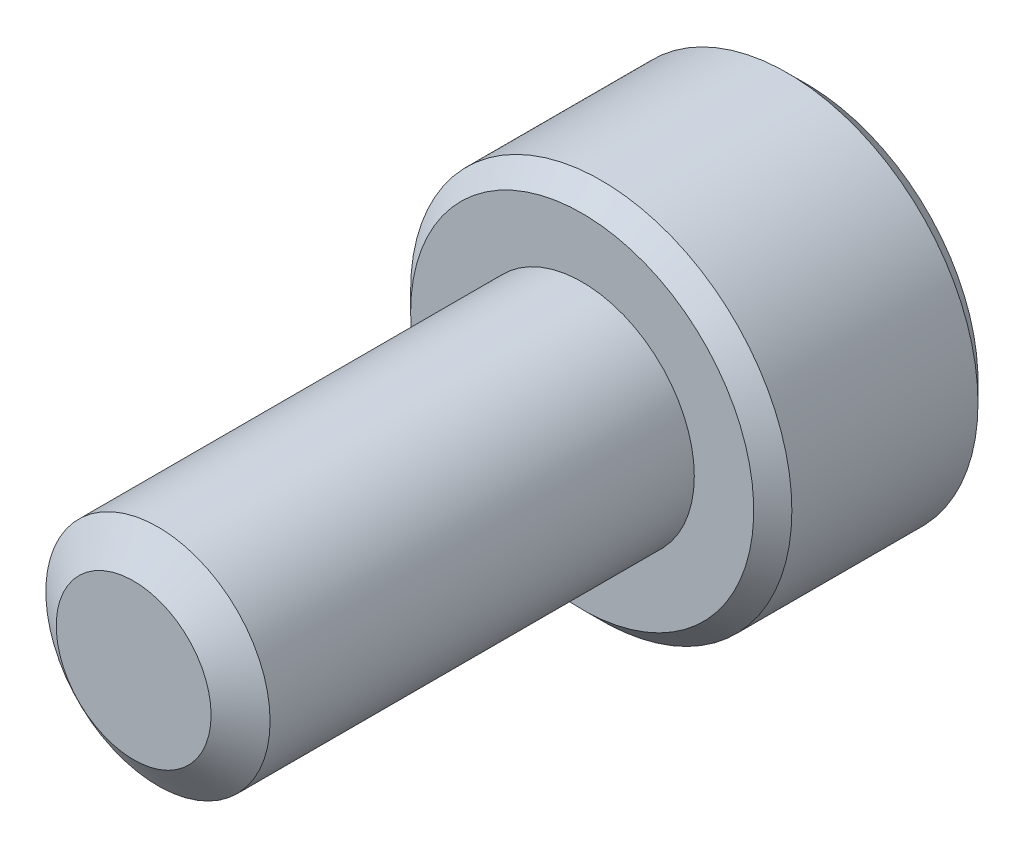
ISO-10303-21;
HEADER;
FILE_DESCRIPTION(('STEP AP214'),'2;1');
FILE_NAME('part.step','',(''),(''),'','','');
FILE_SCHEMA(('AUTOMOTIVE_DESIGN { 1 0 10303 214 1 1 1 1 }'));
ENDSEC;
DATA;
#1=APPLICATION_CONTEXT('core data for automotive mechanical design processes');
#2=APPLICATION_PROTOCOL_DEFINITION('international standard','automotive_design',2000,#1);
#3=PRODUCT_CONTEXT('',#1,'mechanical');
#4=PRODUCT('Part','Part','',(#3));
#5=PRODUCT_RELATED_PRODUCT_CATEGORY('part','',(#4));
#6=PRODUCT_DEFINITION_FORMATION('','',#4);
#7=PRODUCT_DEFINITION_CONTEXT('part definition',#1,'design');
#8=PRODUCT_DEFINITION('design','',#6,#7);
#9=PRODUCT_DEFINITION_SHAPE('','',#8);
#10=(LENGTH_UNIT() NAMED_UNIT(*) SI_UNIT(.MILLI.,.METRE.));
#11=(NAMED_UNIT(*) PLANE_ANGLE_UNIT() SI_UNIT($,.RADIAN.));
#12=(NAMED_UNIT(*) SI_UNIT($,.STERADIAN.) SOLID_ANGLE_UNIT());
#13=UNCERTAINTY_MEASURE_WITH_UNIT(LENGTH_MEASURE(1.E-05),#10,'distance_accuracy_value','');
#14=(GEOMETRIC_REPRESENTATION_CONTEXT(3) GLOBAL_UNCERTAINTY_ASSIGNED_CONTEXT((#13)) GLOBAL_UNIT_ASSIGNED_CONTEXT((#10,
#11,#12)) REPRESENTATION_CONTEXT('',''));
#15=CARTESIAN_POINT('',(0.,0.,0.));
#16=DIRECTION('',(0.,0.,1.));
#17=DIRECTION('',(1.,0.,0.));
#18=AXIS2_PLACEMENT_3D('',#15,#16,#17);
#19=CARTESIAN_POINT('',(0.,0.,-10.));
#20=DIRECTION('',(0.,0.,1.));
#21=DIRECTION('',(1.,0.,0.));
#22=AXIS2_PLACEMENT_3D('',#19,#20,#21);
#23=CYLINDRICAL_SURFACE('',#22,2.5);
#24=CARTESIAN_POINT('',(0.,0.,-10.));
#25=DIRECTION('',(0.,0.,-1.));
#26=DIRECTION('',(-1.,0.,0.));
#27=AXIS2_PLACEMENT_3D('',#24,#25,#26);
#28=CIRCLE('',#27,2.5);
#29=CARTESIAN_POINT('',(-2.50000000000001,0.,-10.));
#30=VERTEX_POINT('',#29);
#31=EDGE_CURVE('E216',#30,#30,#28,.F.);
#32=ORIENTED_EDGE('',*,*,#31,.T.);
#33=EDGE_LOOP('',(#32));
#34=FACE_BOUND('',#33,.T.);
#35=CARTESIAN_POINT('',(0.,0.,-0.541691224311858));
#36=DIRECTION('',(0.,0.,1.));
#37=DIRECTION('',(1.,0.,0.));
#38=AXIS2_PLACEMENT_3D('',#35,#36,#37);
#39=CIRCLE('',#38,2.5);
#40=CARTESIAN_POINT('',(2.50000000000001,0.,-0.541691224311858));
#41=VERTEX_POINT('',#40);
#42=EDGE_CURVE('E110',#41,#41,#39,.T.);
#43=ORIENTED_EDGE('',*,*,#42,.F.);
#44=EDGE_LOOP('',(#43));
#45=FACE_BOUND('',#44,.T.);
#46=ADVANCED_FACE('F36',(#34,#45),#23,.T.);
#47=CARTESIAN_POINT('',(0.,0.,0.));
#48=DIRECTION('',(0.,0.,-1.));
#49=DIRECTION('',(-1.,0.,0.));
#50=AXIS2_PLACEMENT_3D('',#47,#48,#49);
#51=CONICAL_SURFACE('',#50,1.72638475772933,0.959931088596884);
#52=ORIENTED_EDGE('',*,*,#42,.T.);
#53=EDGE_LOOP('',(#52));
#54=FACE_BOUND('',#53,.T.);
#55=CARTESIAN_POINT('',(0.,0.,0.));
#56=DIRECTION('',(0.,0.,1.));
#57=DIRECTION('',(1.,0.,0.));
#58=AXIS2_PLACEMENT_3D('',#55,#56,#57);
#59=CIRCLE('',#58,1.72638475772933);
#60=CARTESIAN_POINT('',(1.72638475772934,0.,0.));
#61=VERTEX_POINT('',#60);
#62=EDGE_CURVE('E214',#61,#61,#59,.T.);
#63=ORIENTED_EDGE('',*,*,#62,.F.);
#64=EDGE_LOOP('',(#63));
#65=FACE_BOUND('',#64,.T.);
#66=ADVANCED_FACE('F197',(#54,#65),#51,.T.);
#67=CARTESIAN_POINT('',(0.,0.,0.));
#68=DIRECTION('',(0.,0.,1.));
#69=DIRECTION('',(1.,0.,0.));
#70=AXIS2_PLACEMENT_3D('',#67,#68,#69);
#71=PLANE('',#70);
#72=ORIENTED_EDGE('',*,*,#62,.T.);
#73=EDGE_LOOP('',(#72));
#74=FACE_BOUND('',#73,.T.);
#75=ADVANCED_FACE('F194',(#74),#71,.T.);
#76=CARTESIAN_POINT('',(0.,0.,-15.));
#77=DIRECTION('',(0.,0.,1.));
#78=DIRECTION('',(1.,0.,0.));
#79=AXIS2_PLACEMENT_3D('',#76,#77,#78);
#80=CYLINDRICAL_SURFACE('',#79,4.25);
#81=CARTESIAN_POINT('',(0.,0.,-14.575));
#82=DIRECTION('',(0.,0.,-1.));
#83=DIRECTION('',(-1.,0.,0.));
#84=AXIS2_PLACEMENT_3D('',#81,#82,#83);
#85=CIRCLE('',#84,4.25);
#86=CARTESIAN_POINT('',(-4.25000000000001,0.,-14.575));
#87=VERTEX_POINT('',#86);
#88=EDGE_CURVE('E44',#87,#87,#85,.F.);
#89=ORIENTED_EDGE('',*,*,#88,.T.);
#90=EDGE_LOOP('',(#89));
#91=FACE_BOUND('',#90,.T.);
#92=CARTESIAN_POINT('',(0.,0.,-10.425));
#93=DIRECTION('',(0.,0.,-1.));
#94=DIRECTION('',(-1.,0.,0.));
#95=AXIS2_PLACEMENT_3D('',#92,#93,#94);
#96=CIRCLE('',#95,4.25);
#97=CARTESIAN_POINT('',(-4.25000000000001,0.,-10.425));
#98=VERTEX_POINT('',#97);
#99=EDGE_CURVE('E173',#98,#98,#96,.T.);
#100=ORIENTED_EDGE('',*,*,#99,.T.);
#101=EDGE_LOOP('',(#100));
#102=FACE_BOUND('',#101,.T.);
#103=ADVANCED_FACE('F178',(#91,#102),#80,.T.);
#104=CARTESIAN_POINT('',(0.,0.,-15.));
#105=DIRECTION('',(0.,0.,-1.));
#106=DIRECTION('',(-1.,0.,0.));
#107=AXIS2_PLACEMENT_3D('',#104,#105,#106);
#108=PLANE('',#107);
#109=CARTESIAN_POINT('',(0.,0.,-15.));
#110=DIRECTION('',(0.,0.,-1.));
#111=DIRECTION('',(-1.,0.,0.));
#112=AXIS2_PLACEMENT_3D('',#109,#110,#111);
#113=CIRCLE('',#112,3.825);
#114=CARTESIAN_POINT('',(-3.82500000000001,0.,-15.));
#115=VERTEX_POINT('',#114);
#116=EDGE_CURVE('E109',#115,#115,#113,.T.);
#117=ORIENTED_EDGE('',*,*,#116,.T.);
#118=EDGE_LOOP('',(#117));
#119=FACE_BOUND('',#118,.T.);
#120=CARTESIAN_POINT('',(0.,0.,-15.));
#121=DIRECTION('',(0.,0.,-1.));
#122=DIRECTION('',(-1.,0.,0.));
#123=AXIS2_PLACEMENT_3D('',#120,#121,#122);
#124=CIRCLE('',#123,2.3094010767585);
#125=CARTESIAN_POINT('',(-2.,1.15470053837925,-15.));
#126=VERTEX_POINT('',#125);
#127=CARTESIAN_POINT('',(0.,2.3094010767585,-15.));
#128=VERTEX_POINT('',#127);
#129=EDGE_CURVE('E90',#126,#128,#124,.T.);
#130=ORIENTED_EDGE('',*,*,#129,.F.);
#131=CARTESIAN_POINT('',(-2.00000000000002,-1.15470053837927,-15.));
#132=VERTEX_POINT('',#131);
#133=EDGE_CURVE('E50',#132,#126,#124,.T.);
#134=ORIENTED_EDGE('',*,*,#133,.F.);
#135=CARTESIAN_POINT('',(0.,-2.3094010767585,-15.));
#136=VERTEX_POINT('',#135);
#137=EDGE_CURVE('E275',#136,#132,#124,.T.);
#138=ORIENTED_EDGE('',*,*,#137,.F.);
#139=CARTESIAN_POINT('',(1.99999999999999,-1.15470053837924,-15.));
#140=VERTEX_POINT('',#139);
#141=EDGE_CURVE('E57',#140,#136,#124,.T.);
#142=ORIENTED_EDGE('',*,*,#141,.F.);
#143=CARTESIAN_POINT('',(2.00000000000001,1.15470053837929,-15.));
#144=VERTEX_POINT('',#143);
#145=EDGE_CURVE('E131',#144,#140,#124,.T.);
#146=ORIENTED_EDGE('',*,*,#145,.F.);
#147=EDGE_CURVE('E99',#128,#144,#124,.T.);
#148=ORIENTED_EDGE('',*,*,#147,.F.);
#149=EDGE_LOOP('',(#130,#134,#138,#142,#146,#148));
#150=FACE_BOUND('',#149,.T.);
#151=ADVANCED_FACE('F130',(#119,#150),#108,.T.);
#152=CARTESIAN_POINT('',(0.,0.,-10.));
#153=DIRECTION('',(0.,0.,-1.));
#154=DIRECTION('',(-1.,0.,0.));
#155=AXIS2_PLACEMENT_3D('',#152,#153,#154);
#156=PLANE('',#155);
#157=CARTESIAN_POINT('',(0.,0.,-10.));
#158=DIRECTION('',(0.,0.,-1.));
#159=DIRECTION('',(-1.,0.,0.));
#160=AXIS2_PLACEMENT_3D('',#157,#158,#159);
#161=CIRCLE('',#160,3.825);
#162=CARTESIAN_POINT('',(-3.82500000000001,0.,-10.));
#163=VERTEX_POINT('',#162);
#164=EDGE_CURVE('E11',#163,#163,#161,.F.);
#165=ORIENTED_EDGE('',*,*,#164,.T.);
#166=EDGE_LOOP('',(#165));
#167=FACE_BOUND('',#166,.T.);
#168=ORIENTED_EDGE('',*,*,#31,.F.);
#169=EDGE_LOOP('',(#168));
#170=FACE_BOUND('',#169,.T.);
#171=ADVANCED_FACE('F187',(#167,#170),#156,.F.);
#172=CARTESIAN_POINT('',(0.,0.,-15.));
#173=DIRECTION('',(0.,0.,-1.));
#174=DIRECTION('',(-1.,0.,0.));
#175=AXIS2_PLACEMENT_3D('',#172,#173,#174);
#176=CONICAL_SURFACE('',#175,2.3094010767585,0.78539816339745);
#177=ORIENTED_EDGE('',*,*,#147,.T.);
#178=CARTESIAN_POINT('',(-0.000199999999989271,2.30951654681237,-15.0001154787137));
#179=CARTESIAN_POINT('',(0.0685530340307101,2.26982196410712,-14.9604530902256));
#180=CARTESIAN_POINT('',(0.138455742135513,2.22946361676572,-14.9231199822842));
#181=CARTESIAN_POINT('',(0.280995244550437,2.14716839667631,-14.8547636851362));
#182=CARTESIAN_POINT('',(0.353645597565361,2.10522369580642,-14.8237785337372));
#183=CARTESIAN_POINT('',(0.500141601053975,2.02064418875706,-14.7707002165442));
#184=CARTESIAN_POINT('',(0.573949935246298,1.97803092714269,-14.7484736271766));
#185=CARTESIAN_POINT('',(0.723191631835269,1.89186619344273,-14.7142288166751));
#186=CARTESIAN_POINT('',(0.798620433918157,1.84831735425553,-14.7021850291441));
#187=CARTESIAN_POINT('',(0.928615500671082,1.77326466747241,-14.6913185119056));
#188=CARTESIAN_POINT('',(0.983013783970109,1.74185780396625,-14.68970975361));
#189=CARTESIAN_POINT('',(1.09172145551969,1.67909540053412,-14.6924188775987));
#190=CARTESIAN_POINT('',(1.14603080592134,1.64773988246022,-14.696738837758));
#191=CARTESIAN_POINT('',(1.25413672758934,1.58532489948421,-14.7110595674099));
#192=CARTESIAN_POINT('',(1.30793265655479,1.55426580541469,-14.721066692762));
#193=CARTESIAN_POINT('',(1.41459426230558,1.49268469862228,-14.7462124302497));
#194=CARTESIAN_POINT('',(1.46746001007072,1.46216264491918,-14.7613506490422));
#195=CARTESIAN_POINT('',(1.60287973308986,1.3839780313805,-14.8062945034292));
#196=CARTESIAN_POINT('',(1.68459383484948,1.33680037273298,-14.8394888394258));
#197=CARTESIAN_POINT('',(1.8047470372578,1.26742988897854,-14.8955258231714));
#198=CARTESIAN_POINT('',(1.84434285210917,1.24456923461531,-14.915214702947));
#199=CARTESIAN_POINT('',(1.92280095888787,1.19927142554653,-14.9563873183649));
#200=CARTESIAN_POINT('',(1.96166368359374,1.17683402097616,-14.9778699516513));
#201=CARTESIAN_POINT('',(2.00020000000001,1.15458506832544,-15.0001154787137));
#202=B_SPLINE_CURVE_WITH_KNOTS('',3,(#178,#179,#180,#181,#182,#183,#184,#185,#186,#187,#188,
#189,#190,#191,#192,#193,#194,#195,#196,#197,#198,#199,#200,#201),.UNSPECIFIED.,.F.,.F.,(4,2,2,
2,2,2,2,2,2,2,2,4),(0.,0.266420613771059,0.534393751523388,0.798110374376916,1.06116288956936,
1.24939906803721,1.43770123566247,1.62621426093932,1.81471283831913,2.11415604834144,
2.2634717071779,2.4126962696977),.UNSPECIFIED.);
#203=EDGE_CURVE('E104',#128,#144,#202,.T.);
#204=ORIENTED_EDGE('',*,*,#203,.F.);
#205=EDGE_LOOP('',(#177,#204));
#206=FACE_BOUND('',#205,.T.);
#207=ADVANCED_FACE('F105',(#206),#176,.F.);
#208=ORIENTED_EDGE('',*,*,#145,.T.);
#209=CARTESIAN_POINT('',(1.99999999999999,-2.30294417292923,-15.7407713550277));
#210=CARTESIAN_POINT('',(2.00000000000002,-2.24687002663711,-15.698443273626));
#211=CARTESIAN_POINT('',(2.00000000000003,-2.19048190536958,-15.6565251568644));
#212=CARTESIAN_POINT('',(2.00000000000004,-2.07695390496423,-15.573690417861));
#213=CARTESIAN_POINT('',(2.00000000000003,-2.01981384066452,-15.5327740496681));
#214=CARTESIAN_POINT('',(2.00000000000003,-1.90424016804774,-15.4518334520186));
#215=CARTESIAN_POINT('',(2.00000000000003,-1.84579996743908,-15.4118185915599));
#216=CARTESIAN_POINT('',(2.00000000000003,-1.72792745461758,-15.3332889936643));
#217=CARTESIAN_POINT('',(2.00000000000003,-1.66849521292322,-15.2947741502432));
#218=CARTESIAN_POINT('',(2.00000000000003,-1.48162995710017,-15.1776406516043));
#219=CARTESIAN_POINT('',(2.00000000000004,-1.35220318163533,-15.1021459017297));
#220=CARTESIAN_POINT('',(2.00000000000002,-1.08689521592923,-14.9640493509944));
#221=CARTESIAN_POINT('',(1.99999999999998,-0.951037763938188,-14.9014040859035));
#222=CARTESIAN_POINT('',(2.,-0.747111912259402,-14.8247635438752));
#223=CARTESIAN_POINT('',(2.00000000000002,-0.682064034147865,-14.8027671799192));
#224=CARTESIAN_POINT('',(2.00000000000003,-0.550398103294739,-14.7639966876602));
#225=CARTESIAN_POINT('',(2.00000000000002,-0.483779942722464,-14.7472229191212));
#226=CARTESIAN_POINT('',(2.00000000000002,-0.350484328847645,-14.7200482578845));
#227=CARTESIAN_POINT('',(2.00000000000003,-0.283829489364776,-14.7095381767417));
#228=CARTESIAN_POINT('',(2.00000000000002,-0.149806987139371,-14.6950960855449));
#229=CARTESIAN_POINT('',(2.00000000000001,-0.0824394489341196,-14.6911629447331));
#230=CARTESIAN_POINT('',(2.00000000000001,0.0499055622944874,-14.6901664769337));
#231=CARTESIAN_POINT('',(2.00000000000002,0.114881285143169,-14.6928596448504));
#232=CARTESIAN_POINT('',(2.00000000000002,0.244275921482759,-14.7044300704227));
#233=CARTESIAN_POINT('',(2.00000000000002,0.308694780266754,-14.7133079288333));
#234=CARTESIAN_POINT('',(2.00000000000002,0.437599788610708,-14.7369136592962));
#235=CARTESIAN_POINT('',(2.00000000000002,0.502067428644598,-14.7517410834466));
#236=CARTESIAN_POINT('',(2.00000000000002,0.629594322598317,-14.786457883628));
#237=CARTESIAN_POINT('',(2.00000000000001,0.69265369388317,-14.8063468361063));
#238=CARTESIAN_POINT('',(2.00000000000001,0.891187889210572,-14.8764469792562));
#239=CARTESIAN_POINT('',(2.00000000000001,1.02383545707307,-14.9346418003215));
#240=CARTESIAN_POINT('',(2.00000000000001,1.28290932150074,-15.0640305754596));
#241=CARTESIAN_POINT('',(2.00000000000001,1.40931112587571,-15.1352712314149));
#242=CARTESIAN_POINT('',(2.00000000000001,1.59200441438964,-15.2464419918747));
#243=CARTESIAN_POINT('',(2.00000000000001,1.65027549026192,-15.2831821903374));
#244=CARTESIAN_POINT('',(2.00000000000001,1.76581760389245,-15.3582145141838));
#245=CARTESIAN_POINT('',(2.00000000000001,1.82308856543107,-15.3965067571181));
#246=CARTESIAN_POINT('',(2.00000000000001,1.93629654762086,-15.4740422640813));
#247=CARTESIAN_POINT('',(2.00000000000001,1.99224062500541,-15.5132752761336));
#248=CARTESIAN_POINT('',(2.00000000000001,2.10336424029902,-15.5927788307365));
#249=CARTESIAN_POINT('',(2.00000000000001,2.15854398422471,-15.6330490850006));
#250=CARTESIAN_POINT('',(2.00000000000003,2.21340370692663,-15.6737442381459));
#251=B_SPLINE_CURVE_WITH_KNOTS('',3,(#209,#210,#211,#212,#213,#214,#215,#216,#217,#218,#219,
#220,#221,#222,#223,#224,#225,#226,#227,#228,#229,#230,#231,#232,#233,#234,#235,#236,#237,#238,
#239,#240,#241,#242,#243,#244,#245,#246,#247,#248,#249,#250),.UNSPECIFIED.,.F.,.F.,(4,2,2,2,2,2,
2,2,2,2,2,2,2,2,2,2,2,2,2,2,4),(0.,0.210772731976884,0.421598374658578,0.634057554623481,
0.846501695870168,1.29562155455624,1.74319622821645,1.94902062110206,2.15485918928324,
2.35699582502634,2.55909770432138,2.75388435553554,2.94868993014813,3.14690093452584,
3.34509535789701,3.77838155837652,4.21325029921625,4.41989056685647,4.62654651460922,
4.8315237711129,5.03644465914085),.UNSPECIFIED.);
#252=EDGE_CURVE('E98',#144,#140,#251,.F.);
#253=ORIENTED_EDGE('',*,*,#252,.F.);
#254=EDGE_LOOP('',(#208,#253));
#255=FACE_BOUND('',#254,.T.);
#256=ADVANCED_FACE('F281',(#255),#176,.F.);
#257=ORIENTED_EDGE('',*,*,#141,.T.);
#258=CARTESIAN_POINT('',(2.00019999999999,-1.15458506832542,-15.0001154787137));
#259=CARTESIAN_POINT('',(1.93144696596928,-1.19427965103065,-14.9604530902256));
#260=CARTESIAN_POINT('',(1.86154425786448,-1.23463799837204,-14.9231199822842));
#261=CARTESIAN_POINT('',(1.71900475544955,-1.31693321846145,-14.8547636851361));
#262=CARTESIAN_POINT('',(1.64635440243463,-1.35887791933134,-14.8237785337372));
#263=CARTESIAN_POINT('',(1.49985839894601,-1.44345742638069,-14.7707002165441));
#264=CARTESIAN_POINT('',(1.42605006475369,-1.48607068799507,-14.7484736271766));
#265=CARTESIAN_POINT('',(1.27680836816472,-1.57223542169503,-14.7142288166751));
#266=CARTESIAN_POINT('',(1.20137956608184,-1.61578426088224,-14.7021850291441));
#267=CARTESIAN_POINT('',(1.07138449932891,-1.69083694766536,-14.6913185119056));
#268=CARTESIAN_POINT('',(1.01698621602988,-1.7222438111715,-14.68970975361));
#269=CARTESIAN_POINT('',(0.908278544480291,-1.78500621460363,-14.6924188775987));
#270=CARTESIAN_POINT('',(0.853969194078646,-1.81636173267754,-14.696738837758));
#271=CARTESIAN_POINT('',(0.745863272410646,-1.87877671565355,-14.7110595674099));
#272=CARTESIAN_POINT('',(0.69206734344519,-1.90983580972306,-14.721066692762));
#273=CARTESIAN_POINT('',(0.585405737694412,-1.97141691651547,-14.7462124302497));
#274=CARTESIAN_POINT('',(0.532539989929278,-2.0019389702186,-14.7613506490422));
#275=CARTESIAN_POINT('',(0.397120266910148,-2.08012358375728,-14.8062945034292));
#276=CARTESIAN_POINT('',(0.315406165150504,-2.12730124240478,-14.8394888394258));
#277=CARTESIAN_POINT('',(0.195252962742175,-2.19667172615922,-14.8955258231714));
#278=CARTESIAN_POINT('',(0.1556571478908,-2.21953238052244,-14.9152147029469));
#279=CARTESIAN_POINT('',(0.0771990411121064,-2.26483018959123,-14.9563873183649));
#280=CARTESIAN_POINT('',(0.0383363164062398,-2.28726759416162,-14.9778699516513));
#281=CARTESIAN_POINT('',(-0.000200000000017027,-2.30951654681236,-15.0001154787137));
#282=B_SPLINE_CURVE_WITH_KNOTS('',3,(#258,#259,#260,#261,#262,#263,#264,#265,#266,#267,#268,
#269,#270,#271,#272,#273,#274,#275,#276,#277,#278,#279,#280,#281),.UNSPECIFIED.,.F.,.F.,(4,2,2,
2,2,2,2,2,2,2,2,4),(0.,0.266420613771064,0.53439375152339,0.798110374376916,1.06116288956936,
1.24939906803722,1.43770123566247,1.62621426093932,1.81471283831913,2.11415604834145,
2.26347170717791,2.41269626969772),.UNSPECIFIED.);
#283=EDGE_CURVE('E141',#140,#136,#282,.T.);
#284=ORIENTED_EDGE('',*,*,#283,.F.);
#285=EDGE_LOOP('',(#257,#284));
#286=FACE_BOUND('',#285,.T.);
#287=ADVANCED_FACE('F278',(#286),#176,.F.);
#288=ORIENTED_EDGE('',*,*,#137,.T.);
#289=CARTESIAN_POINT('',(0.000199999999995343,-2.30951654681234,-15.0001154787137));
#290=CARTESIAN_POINT('',(-0.0685530340307168,-2.26982196410711,-14.9604530902256));
#291=CARTESIAN_POINT('',(-0.138455742135525,-2.22946361676572,-14.9231199822842));
#292=CARTESIAN_POINT('',(-0.280995244550453,-2.14716839667632,-14.8547636851362));
#293=CARTESIAN_POINT('',(-0.353645597565375,-2.10522369580643,-14.8237785337372));
#294=CARTESIAN_POINT('',(-0.500141601053987,-2.02064418875707,-14.7707002165442));
#295=CARTESIAN_POINT('',(-0.573949935246309,-1.97803092714269,-14.7484736271766));
#296=CARTESIAN_POINT('',(-0.723191631835283,-1.89186619344274,-14.7142288166751));
#297=CARTESIAN_POINT('',(-0.798620433918176,-1.84831735425556,-14.7021850291441));
#298=CARTESIAN_POINT('',(-0.928615500671098,-1.77326466747243,-14.6913185119056));
#299=CARTESIAN_POINT('',(-0.983013783970121,-1.74185780396626,-14.68970975361));
#300=CARTESIAN_POINT('',(-1.0917214555197,-1.67909540053412,-14.6924188775987));
#301=CARTESIAN_POINT('',(-1.14603080592135,-1.64773988246022,-14.696738837758));
#302=CARTESIAN_POINT('',(-1.25413672758935,-1.58532489948421,-14.7110595674099));
#303=CARTESIAN_POINT('',(-1.30793265655481,-1.5542658054147,-14.721066692762));
#304=CARTESIAN_POINT('',(-1.41459426230559,-1.49268469862228,-14.7462124302497));
#305=CARTESIAN_POINT('',(-1.46746001007073,-1.46216264491916,-14.7613506490422));
#306=CARTESIAN_POINT('',(-1.60287973308986,-1.38397803138048,-14.8062945034292));
#307=CARTESIAN_POINT('',(-1.68459383484949,-1.33680037273298,-14.8394888394258));
#308=CARTESIAN_POINT('',(-1.8047470372578,-1.26742988897855,-14.8955258231714));
#309=CARTESIAN_POINT('',(-1.84434285210918,-1.24456923461532,-14.915214702947));
#310=CARTESIAN_POINT('',(-1.92280095888787,-1.19927142554654,-14.9563873183649));
#311=CARTESIAN_POINT('',(-1.96166368359374,-1.17683402097617,-14.9778699516513));
#312=CARTESIAN_POINT('',(-2.00020000000001,-1.15458506832545,-15.0001154787137));
#313=B_SPLINE_CURVE_WITH_KNOTS('',3,(#289,#290,#291,#292,#293,#294,#295,#296,#297,#298,#299,
#300,#301,#302,#303,#304,#305,#306,#307,#308,#309,#310,#311,#312),.UNSPECIFIED.,.F.,.F.,(4,2,2,
2,2,2,2,2,2,2,2,4),(0.,0.266420613771055,0.534393751523384,0.798110374376911,1.06116288956935,
1.24939906803721,1.43770123566247,1.62621426093931,1.81471283831913,2.11415604834143,
2.26347170717789,2.41269626969768),.UNSPECIFIED.);
#314=EDGE_CURVE('E252',#136,#132,#313,.T.);
#315=ORIENTED_EDGE('',*,*,#314,.F.);
#316=EDGE_LOOP('',(#288,#315));
#317=FACE_BOUND('',#316,.T.);
#318=ADVANCED_FACE('F277',(#317),#176,.F.);
#319=ORIENTED_EDGE('',*,*,#133,.T.);
#320=CARTESIAN_POINT('',(-2.00000000000002,-2.30294417326432,-15.7407713552807));
#321=CARTESIAN_POINT('',(-2.00000000000002,-2.2468700269628,-15.6984432738692));
#322=CARTESIAN_POINT('',(-2.00000000000001,-2.19048190568584,-15.6565251570979));
#323=CARTESIAN_POINT('',(-2.00000000000001,-2.07695390526153,-15.5736904180752));
#324=CARTESIAN_POINT('',(-2.00000000000001,-2.0198138409523,-15.5327740498725));
#325=CARTESIAN_POINT('',(-2.00000000000001,-1.90424016831615,-15.4518334522036));
#326=CARTESIAN_POINT('',(-2.00000000000001,-1.84579996769764,-15.4118185917352));
#327=CARTESIAN_POINT('',(-2.00000000000001,-1.72792745485626,-15.3332889938203));
#328=CARTESIAN_POINT('',(-2.00000000000001,-1.66849521315186,-15.2947741503896));
#329=CARTESIAN_POINT('',(-2.00000000000002,-1.48162995729573,-15.1776406517203));
#330=CARTESIAN_POINT('',(-2.00000000000002,-1.35220318180735,-15.1021459018253));
#331=CARTESIAN_POINT('',(-2.00000000000001,-1.08689521605218,-14.9640493510523));
#332=CARTESIAN_POINT('',(-1.99999999999999,-0.951037764035633,-14.901404085944));
#333=CARTESIAN_POINT('',(-2.00000000000001,-0.747111912337647,-14.8247635439028));
#334=CARTESIAN_POINT('',(-2.00000000000002,-0.682064034234147,-14.8027671799473));
#335=CARTESIAN_POINT('',(-2.00000000000002,-0.550398103397359,-14.7639966876877));
#336=CARTESIAN_POINT('',(-2.00000000000002,-0.483779942833385,-14.7472229191476));
#337=CARTESIAN_POINT('',(-2.00000000000002,-0.350484328974895,-14.7200482579067));
#338=CARTESIAN_POINT('',(-2.00000000000003,-0.283829489500049,-14.709538176761));
#339=CARTESIAN_POINT('',(-2.00000000000002,-0.149806987290422,-14.6950960855565));
#340=CARTESIAN_POINT('',(-2.,-0.0824394490929262,-14.6911629447399));
#341=CARTESIAN_POINT('',(-2.,0.0499055621213714,-14.6901664769296));
#342=CARTESIAN_POINT('',(-2.00000000000002,0.114881284963479,-14.6928596448403));
#343=CARTESIAN_POINT('',(-2.00000000000003,0.244275921290579,-14.7044300703996));
#344=CARTESIAN_POINT('',(-2.00000000000003,0.308694780068657,-14.7133079288032));
#345=CARTESIAN_POINT('',(-2.00000000000003,0.437599788400932,-14.7369136592515));
#346=CARTESIAN_POINT('',(-2.00000000000003,0.502067428429078,-14.7517410833942));
#347=CARTESIAN_POINT('',(-2.00000000000002,0.629594322371859,-14.7864578835601));
#348=CARTESIAN_POINT('',(-2.00000000000001,0.692653693651517,-14.8063468360305));
#349=CARTESIAN_POINT('',(-1.99999999999998,0.891187888928475,-14.8764469791434));
#350=CARTESIAN_POINT('',(-2.00000000000002,1.02383545674826,-14.9346418001747));
#351=CARTESIAN_POINT('',(-2.00000000000004,1.28290932109377,-15.0640305752409));
#352=CARTESIAN_POINT('',(-2.00000000000003,1.40931112542931,-15.1352712311583));
#353=CARTESIAN_POINT('',(-2.00000000000003,1.59200441388854,-15.2464419915628));
#354=CARTESIAN_POINT('',(-2.00000000000003,1.6502754897448,-15.2831821900084));
#355=CARTESIAN_POINT('',(-2.00000000000004,1.76581760334353,-15.3582145138206));
#356=CARTESIAN_POINT('',(-2.00000000000003,1.82308856486637,-15.3965067567377));
#357=CARTESIAN_POINT('',(-2.00000000000004,1.93629654702499,-15.4740422636668));
#358=CARTESIAN_POINT('',(-2.00000000000004,1.99224062439413,-15.5132752757023));
#359=CARTESIAN_POINT('',(-2.00000000000003,2.10336423965704,-15.5927788302713));
#360=CARTESIAN_POINT('',(-2.00000000000002,2.15854398356742,-15.6330490845185));
#361=CARTESIAN_POINT('',(-1.99999999999999,2.21340370625406,-15.6737442376469));
#362=B_SPLINE_CURVE_WITH_KNOTS('',3,(#320,#321,#322,#323,#324,#325,#326,#327,#328,#329,#330,
#331,#332,#333,#334,#335,#336,#337,#338,#339,#340,#341,#342,#343,#344,#345,#346,#347,#348,#349,
#350,#351,#352,#353,#354,#355,#356,#357,#358,#359,#360,#361),.UNSPECIFIED.,.F.,.F.,(4,2,2,2,2,2,
2,2,2,2,2,2,2,2,2,2,2,2,2,2,4),(0.,0.210772732017003,0.421598374738829,0.634057554744618,
0.846501696032183,1.29562155480995,1.74319622856098,1.94902062142335,2.15485918958133,
2.35699582530217,2.55909770457495,2.75388435576874,2.94868993036094,3.1469009347167,
3.34509535806592,3.77838155838771,4.21325029906867,4.41989056664097,4.6265465143258,
4.83152377076248,5.03644465872343),.UNSPECIFIED.);
#363=EDGE_CURVE('E120',#132,#126,#362,.T.);
#364=ORIENTED_EDGE('',*,*,#363,.F.);
#365=EDGE_LOOP('',(#319,#364));
#366=FACE_BOUND('',#365,.T.);
#367=ADVANCED_FACE('F290',(#366),#176,.F.);
#368=ORIENTED_EDGE('',*,*,#129,.T.);
#369=CARTESIAN_POINT('',(-2.0002,1.15458506832542,-15.0001154787137));
#370=CARTESIAN_POINT('',(-1.93144696596929,1.19427965103064,-14.9604530902256));
#371=CARTESIAN_POINT('',(-1.86154425786448,1.23463799837203,-14.9231199822842));
#372=CARTESIAN_POINT('',(-1.71900475544955,1.31693321846144,-14.8547636851361));
#373=CARTESIAN_POINT('',(-1.64635440243463,1.35887791933132,-14.8237785337372));
#374=CARTESIAN_POINT('',(-1.49985839894602,1.44345742638068,-14.7707002165441));
#375=CARTESIAN_POINT('',(-1.42605006475369,1.48607068799505,-14.7484736271766));
#376=CARTESIAN_POINT('',(-1.27680836816473,1.57223542169501,-14.7142288166751));
#377=CARTESIAN_POINT('',(-1.20137956608184,1.61578426088223,-14.7021850291441));
#378=CARTESIAN_POINT('',(-1.07138449932891,1.69083694766535,-14.6913185119056));
#379=CARTESIAN_POINT('',(-1.01698621602988,1.72224381117149,-14.68970975361));
#380=CARTESIAN_POINT('',(-0.908278544480289,1.78500621460362,-14.6924188775987));
#381=CARTESIAN_POINT('',(-0.853969194078645,1.81636173267752,-14.696738837758));
#382=CARTESIAN_POINT('',(-0.745863272410643,1.87877671565354,-14.7110595674099));
#383=CARTESIAN_POINT('',(-0.692067343445185,1.90983580972304,-14.721066692762));
#384=CARTESIAN_POINT('',(-0.585405737694409,1.97141691651546,-14.7462124302497));
#385=CARTESIAN_POINT('',(-0.532539989929279,2.00193897021859,-14.7613506490422));
#386=CARTESIAN_POINT('',(-0.397120266910153,2.08012358375728,-14.8062945034292));
#387=CARTESIAN_POINT('',(-0.315406165150503,2.12730124240477,-14.8394888394258));
#388=CARTESIAN_POINT('',(-0.195252962742174,2.1966717261592,-14.8955258231714));
#389=CARTESIAN_POINT('',(-0.1556571478908,2.21953238052243,-14.9152147029469));
#390=CARTESIAN_POINT('',(-0.0771990411121087,2.26483018959122,-14.9563873183649));
#391=CARTESIAN_POINT('',(-0.0383363164062434,2.2872675941616,-14.9778699516512));
#392=CARTESIAN_POINT('',(0.000200000000013557,2.30951654681233,-15.0001154787137));
#393=B_SPLINE_CURVE_WITH_KNOTS('',3,(#369,#370,#371,#372,#373,#374,#375,#376,#377,#378,#379,
#380,#381,#382,#383,#384,#385,#386,#387,#388,#389,#390,#391,#392),.UNSPECIFIED.,.F.,.F.,(4,2,2,
2,2,2,2,2,2,2,2,4),(0.,0.266420613771066,0.53439375152339,0.798110374376916,1.06116288956937,
1.24939906803722,1.43770123566248,1.62621426093933,1.81471283831914,2.11415604834146,
2.26347170717791,2.41269626969772),.UNSPECIFIED.);
#394=EDGE_CURVE('E94',#126,#128,#393,.T.);
#395=ORIENTED_EDGE('',*,*,#394,.F.);
#396=EDGE_LOOP('',(#368,#395));
#397=FACE_BOUND('',#396,.T.);
#398=ADVANCED_FACE('F92',(#397),#176,.F.);
#399=CARTESIAN_POINT('',(2.00000000000003,3.4641016151378,-12.));
#400=DIRECTION('',(0.,0.,-1.));
#401=DIRECTION('',(-1.,0.,0.));
#402=AXIS2_PLACEMENT_3D('',#399,#400,#401);
#403=PLANE('',#402);
#404=DIRECTION('',(0.866025403784444,0.500000000000008,0.));
#405=VECTOR('',#404,1.);
#406=CARTESIAN_POINT('',(-1.99999999999999,1.15470053837924,-12.));
#407=LINE('',#406,#405);
#408=CARTESIAN_POINT('',(-1.99999999999999,1.15470053837924,-12.));
#409=VERTEX_POINT('',#408);
#410=CARTESIAN_POINT('',(0.,2.3094010767585,-12.));
#411=VERTEX_POINT('',#410);
#412=EDGE_CURVE('E119',#409,#411,#407,.T.);
#413=ORIENTED_EDGE('',*,*,#412,.T.);
#414=DIRECTION('',(0.866025403784437,-0.499999999999999,0.));
#415=VECTOR('',#414,1.);
#416=CARTESIAN_POINT('',(0.,2.3094010767585,-12.));
#417=LINE('',#416,#415);
#418=CARTESIAN_POINT('',(2.00000000000001,1.15470053837929,-12.));
#419=VERTEX_POINT('',#418);
#420=EDGE_CURVE('E124',#411,#419,#417,.T.);
#421=ORIENTED_EDGE('',*,*,#420,.T.);
#422=DIRECTION('',(0.,-1.00000000000001,0.));
#423=VECTOR('',#422,1.);
#424=CARTESIAN_POINT('',(2.00000000000001,1.15470053837929,-12.));
#425=LINE('',#424,#423);
#426=CARTESIAN_POINT('',(2.,-1.15470053837925,-12.));
#427=VERTEX_POINT('',#426);
#428=EDGE_CURVE('E238',#419,#427,#425,.T.);
#429=ORIENTED_EDGE('',*,*,#428,.T.);
#430=DIRECTION('',(-0.866025403784443,-0.50000000000001,0.));
#431=VECTOR('',#430,1.);
#432=CARTESIAN_POINT('',(2.,-1.15470053837925,-12.));
#433=LINE('',#432,#431);
#434=CARTESIAN_POINT('',(0.,-2.30940107675851,-12.));
#435=VERTEX_POINT('',#434);
#436=EDGE_CURVE('E235',#427,#435,#433,.T.);
#437=ORIENTED_EDGE('',*,*,#436,.T.);
#438=DIRECTION('',(-0.866025403784438,0.5,0.));
#439=VECTOR('',#438,1.);
#440=CARTESIAN_POINT('',(0.,-2.30940107675851,-12.));
#441=LINE('',#440,#439);
#442=CARTESIAN_POINT('',(-2.00000000000002,-1.15470053837927,-12.));
#443=VERTEX_POINT('',#442);
#444=EDGE_CURVE('E232',#435,#443,#441,.T.);
#445=ORIENTED_EDGE('',*,*,#444,.T.);
#446=DIRECTION('',(0.,1.00000000000001,0.));
#447=VECTOR('',#446,1.);
#448=CARTESIAN_POINT('',(-2.00000000000002,-1.15470053837927,-12.));
#449=LINE('',#448,#447);
#450=EDGE_CURVE('E127',#443,#409,#449,.T.);
#451=ORIENTED_EDGE('',*,*,#450,.T.);
#452=EDGE_LOOP('',(#413,#421,#429,#437,#445,#451));
#453=FACE_BOUND('',#452,.T.);
#454=ADVANCED_FACE('F161',(#453),#403,.T.);
#455=CARTESIAN_POINT('',(0.,2.3094010767585,-12.));
#456=DIRECTION('',(0.500000000000006,0.866025403784449,0.));
#457=DIRECTION('',(-0.866025403784437,0.499999999999999,0.));
#458=AXIS2_PLACEMENT_3D('',#455,#456,#457);
#459=PLANE('',#458);
#460=DIRECTION('',(0.,0.,-1.));
#461=VECTOR('',#460,1.);
#462=CARTESIAN_POINT('',(0.,2.3094010767585,-12.));
#463=LINE('',#462,#461);
#464=EDGE_CURVE('E116',#411,#128,#463,.T.);
#465=ORIENTED_EDGE('',*,*,#464,.T.);
#466=ORIENTED_EDGE('',*,*,#203,.T.);
#467=DIRECTION('',(0.,0.,-1.));
#468=VECTOR('',#467,1.);
#469=CARTESIAN_POINT('',(2.00000000000001,1.15470053837929,-12.));
#470=LINE('',#469,#468);
#471=EDGE_CURVE('E126',#419,#144,#470,.T.);
#472=ORIENTED_EDGE('',*,*,#471,.F.);
#473=ORIENTED_EDGE('',*,*,#420,.F.);
#474=EDGE_LOOP('',(#465,#466,#472,#473));
#475=FACE_BOUND('',#474,.T.);
#476=ADVANCED_FACE('F122',(#475),#459,.F.);
#477=CARTESIAN_POINT('',(2.00000000000001,1.15470053837929,-12.));
#478=DIRECTION('',(1.,0.,0.));
#479=DIRECTION('',(0.,0.,-1.));
#480=AXIS2_PLACEMENT_3D('',#477,#478,#479);
#481=PLANE('',#480);
#482=ORIENTED_EDGE('',*,*,#471,.T.);
#483=ORIENTED_EDGE('',*,*,#252,.T.);
#484=DIRECTION('',(0.,0.,-1.));
#485=VECTOR('',#484,1.);
#486=CARTESIAN_POINT('',(2.,-1.15470053837925,-12.));
#487=LINE('',#486,#485);
#488=EDGE_CURVE('E221',#427,#140,#487,.T.);
#489=ORIENTED_EDGE('',*,*,#488,.F.);
#490=ORIENTED_EDGE('',*,*,#428,.F.);
#491=EDGE_LOOP('',(#482,#483,#489,#490));
#492=FACE_BOUND('',#491,.T.);
#493=ADVANCED_FACE('F150',(#492),#481,.F.);
#494=CARTESIAN_POINT('',(2.,-1.15470053837925,-12.));
#495=DIRECTION('',(0.499999999999996,-0.866025403784442,0.));
#496=DIRECTION('',(0.866025403784443,0.50000000000001,0.));
#497=AXIS2_PLACEMENT_3D('',#494,#495,#496);
#498=PLANE('',#497);
#499=ORIENTED_EDGE('',*,*,#488,.T.);
#500=ORIENTED_EDGE('',*,*,#283,.T.);
#501=DIRECTION('',(0.,0.,-1.));
#502=VECTOR('',#501,1.);
#503=CARTESIAN_POINT('',(0.,-2.30940107675851,-12.));
#504=LINE('',#503,#502);
#505=EDGE_CURVE('E224',#435,#136,#504,.T.);
#506=ORIENTED_EDGE('',*,*,#505,.F.);
#507=ORIENTED_EDGE('',*,*,#436,.F.);
#508=EDGE_LOOP('',(#499,#500,#506,#507));
#509=FACE_BOUND('',#508,.T.);
#510=ADVANCED_FACE('F154',(#509),#498,.F.);
#511=CARTESIAN_POINT('',(0.,-2.30940107675851,-12.));
#512=DIRECTION('',(-0.500000000000007,-0.866025403784448,0.));
#513=DIRECTION('',(0.866025403784438,-0.5,0.));
#514=AXIS2_PLACEMENT_3D('',#511,#512,#513);
#515=PLANE('',#514);
#516=ORIENTED_EDGE('',*,*,#505,.T.);
#517=ORIENTED_EDGE('',*,*,#314,.T.);
#518=DIRECTION('',(0.,0.,-1.));
#519=VECTOR('',#518,1.);
#520=CARTESIAN_POINT('',(-2.00000000000002,-1.15470053837927,-12.));
#521=LINE('',#520,#519);
#522=EDGE_CURVE('E227',#443,#132,#521,.T.);
#523=ORIENTED_EDGE('',*,*,#522,.F.);
#524=ORIENTED_EDGE('',*,*,#444,.F.);
#525=EDGE_LOOP('',(#516,#517,#523,#524));
#526=FACE_BOUND('',#525,.T.);
#527=ADVANCED_FACE('F260',(#526),#515,.F.);
#528=CARTESIAN_POINT('',(-2.00000000000002,-1.15470053837927,-12.));
#529=DIRECTION('',(-1.,0.,0.));
#530=DIRECTION('',(0.,-1.00000000000001,0.));
#531=AXIS2_PLACEMENT_3D('',#528,#529,#530);
#532=PLANE('',#531);
#533=ORIENTED_EDGE('',*,*,#522,.T.);
#534=ORIENTED_EDGE('',*,*,#363,.T.);
#535=DIRECTION('',(0.,0.,-1.));
#536=VECTOR('',#535,1.);
#537=CARTESIAN_POINT('',(-1.99999999999999,1.15470053837924,-12.));
#538=LINE('',#537,#536);
#539=EDGE_CURVE('E118',#409,#126,#538,.T.);
#540=ORIENTED_EDGE('',*,*,#539,.F.);
#541=ORIENTED_EDGE('',*,*,#450,.F.);
#542=EDGE_LOOP('',(#533,#534,#540,#541));
#543=FACE_BOUND('',#542,.T.);
#544=ADVANCED_FACE('F257',(#543),#532,.F.);
#545=CARTESIAN_POINT('',(-1.99999999999999,1.15470053837924,-12.));
#546=DIRECTION('',(-0.499999999999995,0.866025403784442,0.));
#547=DIRECTION('',(-0.866025403784444,-0.500000000000008,0.));
#548=AXIS2_PLACEMENT_3D('',#545,#546,#547);
#549=PLANE('',#548);
#550=ORIENTED_EDGE('',*,*,#539,.T.);
#551=ORIENTED_EDGE('',*,*,#394,.T.);
#552=ORIENTED_EDGE('',*,*,#464,.F.);
#553=ORIENTED_EDGE('',*,*,#412,.F.);
#554=EDGE_LOOP('',(#550,#551,#552,#553));
#555=FACE_BOUND('',#554,.T.);
#556=ADVANCED_FACE('F114',(#555),#549,.F.);
#557=CARTESIAN_POINT('',(0.,0.,-15.));
#558=DIRECTION('',(0.,0.,1.));
#559=DIRECTION('',(1.,0.,0.));
#560=AXIS2_PLACEMENT_3D('',#557,#558,#559);
#561=CONICAL_SURFACE('',#560,3.825,0.785398163397442);
#562=ORIENTED_EDGE('',*,*,#88,.F.);
#563=EDGE_LOOP('',(#562));
#564=FACE_BOUND('',#563,.T.);
#565=ORIENTED_EDGE('',*,*,#116,.F.);
#566=EDGE_LOOP('',(#565));
#567=FACE_BOUND('',#566,.T.);
#568=ADVANCED_FACE('F181',(#564,#567),#561,.T.);
#569=CARTESIAN_POINT('',(0.,0.,-10.425));
#570=DIRECTION('',(0.,0.,-1.));
#571=DIRECTION('',(-1.,0.,0.));
#572=AXIS2_PLACEMENT_3D('',#569,#570,#571);
#573=CONICAL_SURFACE('',#572,4.25,0.785398163397452);
#574=ORIENTED_EDGE('',*,*,#164,.F.);
#575=EDGE_LOOP('',(#574));
#576=FACE_BOUND('',#575,.T.);
#577=ORIENTED_EDGE('',*,*,#99,.F.);
#578=EDGE_LOOP('',(#577));
#579=FACE_BOUND('',#578,.T.);
#580=ADVANCED_FACE('F38',(#576,#579),#573,.T.);
#581=CLOSED_SHELL('',(#46,#66,#75,#103,#151,#171,#207,#256,#287,#318,#367,#398,#454,#476,#493,
#510,#527,#544,#556,#568,#580));
#582=MANIFOLD_SOLID_BREP('B2',#581);
#583=ADVANCED_BREP_SHAPE_REPRESENTATION('',(#18,#582),#14);
#584=SHAPE_DEFINITION_REPRESENTATION(#9,#583);
ENDSEC;
END-ISO-10303-21;
